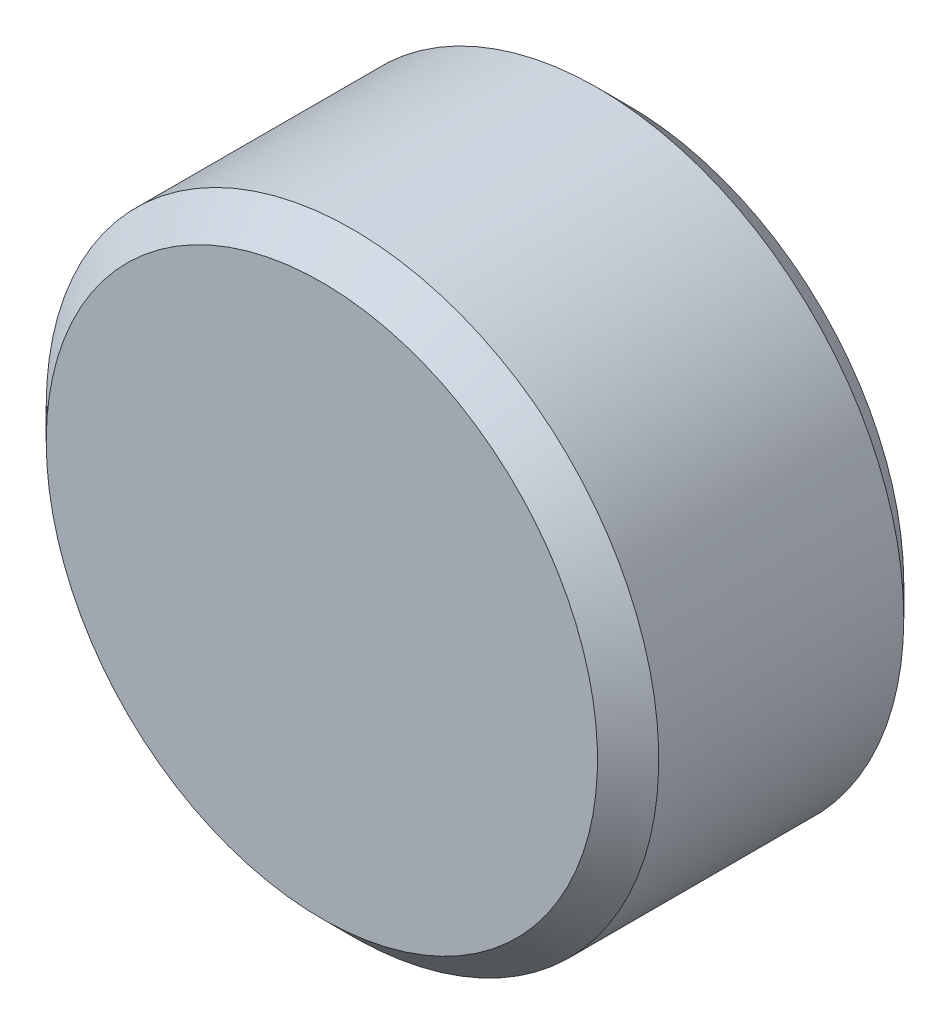
ISO-10303-21;
HEADER;
FILE_DESCRIPTION(('STEP AP214'),'2;1');
FILE_NAME('part.step','',(''),(''),'','','');
FILE_SCHEMA(('AUTOMOTIVE_DESIGN { 1 0 10303 214 1 1 1 1 }'));
ENDSEC;
DATA;
#1=APPLICATION_CONTEXT('core data for automotive mechanical design processes');
#2=APPLICATION_PROTOCOL_DEFINITION('international standard','automotive_design',2000,#1);
#3=PRODUCT_CONTEXT('',#1,'mechanical');
#4=PRODUCT('Part','Part','',(#3));
#5=PRODUCT_RELATED_PRODUCT_CATEGORY('part','',(#4));
#6=PRODUCT_DEFINITION_FORMATION('','',#4);
#7=PRODUCT_DEFINITION_CONTEXT('part definition',#1,'design');
#8=PRODUCT_DEFINITION('design','',#6,#7);
#9=PRODUCT_DEFINITION_SHAPE('','',#8);
#10=(LENGTH_UNIT() NAMED_UNIT(*) SI_UNIT(.MILLI.,.METRE.));
#11=(NAMED_UNIT(*) PLANE_ANGLE_UNIT() SI_UNIT($,.RADIAN.));
#12=(NAMED_UNIT(*) SI_UNIT($,.STERADIAN.) SOLID_ANGLE_UNIT());
#13=UNCERTAINTY_MEASURE_WITH_UNIT(LENGTH_MEASURE(1.E-05),#10,'distance_accuracy_value','');
#14=(GEOMETRIC_REPRESENTATION_CONTEXT(3) GLOBAL_UNCERTAINTY_ASSIGNED_CONTEXT((#13)) GLOBAL_UNIT_ASSIGNED_CONTEXT((#10,
#11,#12)) REPRESENTATION_CONTEXT('',''));
#15=CARTESIAN_POINT('',(0.,0.,0.));
#16=DIRECTION('',(0.,0.,1.));
#17=DIRECTION('',(1.,0.,0.));
#18=AXIS2_PLACEMENT_3D('',#15,#16,#17);
#19=CARTESIAN_POINT('',(0.,0.,3.));
#20=DIRECTION('',(0.,0.,-1.));
#21=DIRECTION('',(-1.,0.,0.));
#22=AXIS2_PLACEMENT_3D('',#19,#20,#21);
#23=CYLINDRICAL_SURFACE('',#22,3.);
#24=CARTESIAN_POINT('',(0.,0.,2.7));
#25=DIRECTION('',(0.,0.,1.));
#26=DIRECTION('',(1.,0.,0.));
#27=AXIS2_PLACEMENT_3D('',#24,#25,#26);
#28=CIRCLE('',#27,3.);
#29=CARTESIAN_POINT('',(-3.,0.,2.7));
#30=VERTEX_POINT('',#29);
#31=EDGE_CURVE('E38',#30,#30,#28,.F.);
#32=CARTESIAN_POINT('',(0.,0.,0.299999999999999));
#33=DIRECTION('',(0.,0.,1.));
#34=DIRECTION('',(1.,0.,0.));
#35=AXIS2_PLACEMENT_3D('',#32,#33,#34);
#36=CIRCLE('',#35,3.);
#37=CARTESIAN_POINT('',(-3.,0.,0.299999999999998));
#38=VERTEX_POINT('',#37);
#39=EDGE_CURVE('E42',#38,#38,#36,.T.);
#40=CARTESIAN_POINT('',(-3.,0.,2.7));
#41=CARTESIAN_POINT('',(-3.,0.,2.675));
#42=CARTESIAN_POINT('',(-3.,0.,2.65));
#43=CARTESIAN_POINT('',(-3.,0.,2.6));
#44=CARTESIAN_POINT('',(-3.,0.,2.575));
#45=CARTESIAN_POINT('',(-3.,0.,2.525));
#46=CARTESIAN_POINT('',(-3.,0.,2.5));
#47=CARTESIAN_POINT('',(-3.,0.,2.45));
#48=CARTESIAN_POINT('',(-3.,0.,2.425));
#49=CARTESIAN_POINT('',(-3.,0.,2.375));
#50=CARTESIAN_POINT('',(-3.,0.,2.35));
#51=CARTESIAN_POINT('',(-3.,0.,2.3));
#52=CARTESIAN_POINT('',(-3.,0.,2.275));
#53=CARTESIAN_POINT('',(-3.,0.,2.225));
#54=CARTESIAN_POINT('',(-3.,0.,2.2));
#55=CARTESIAN_POINT('',(-3.,0.,2.15));
#56=CARTESIAN_POINT('',(-3.,0.,2.125));
#57=CARTESIAN_POINT('',(-3.,0.,2.075));
#58=CARTESIAN_POINT('',(-3.,0.,2.05));
#59=CARTESIAN_POINT('',(-3.,0.,2.));
#60=CARTESIAN_POINT('',(-3.,0.,1.975));
#61=CARTESIAN_POINT('',(-3.,0.,1.925));
#62=CARTESIAN_POINT('',(-3.,0.,1.9));
#63=CARTESIAN_POINT('',(-3.,0.,1.85));
#64=CARTESIAN_POINT('',(-3.,0.,1.825));
#65=CARTESIAN_POINT('',(-3.,0.,1.775));
#66=CARTESIAN_POINT('',(-3.,0.,1.75));
#67=CARTESIAN_POINT('',(-3.,0.,1.7));
#68=CARTESIAN_POINT('',(-3.,0.,1.675));
#69=CARTESIAN_POINT('',(-3.,0.,1.625));
#70=CARTESIAN_POINT('',(-3.,0.,1.6));
#71=CARTESIAN_POINT('',(-3.,0.,1.55));
#72=CARTESIAN_POINT('',(-3.,0.,1.525));
#73=CARTESIAN_POINT('',(-3.,0.,1.475));
#74=CARTESIAN_POINT('',(-3.,0.,1.45));
#75=CARTESIAN_POINT('',(-3.,0.,1.4));
#76=CARTESIAN_POINT('',(-3.,0.,1.375));
#77=CARTESIAN_POINT('',(-3.,0.,1.325));
#78=CARTESIAN_POINT('',(-3.,0.,1.3));
#79=CARTESIAN_POINT('',(-3.,0.,1.25));
#80=CARTESIAN_POINT('',(-3.,0.,1.225));
#81=CARTESIAN_POINT('',(-3.,0.,1.175));
#82=CARTESIAN_POINT('',(-3.,0.,1.15));
#83=CARTESIAN_POINT('',(-3.,0.,1.1));
#84=CARTESIAN_POINT('',(-3.,0.,1.075));
#85=CARTESIAN_POINT('',(-3.,0.,1.025));
#86=CARTESIAN_POINT('',(-3.,0.,0.999999999999999));
#87=CARTESIAN_POINT('',(-3.,0.,0.949999999999999));
#88=CARTESIAN_POINT('',(-3.,0.,0.924999999999999));
#89=CARTESIAN_POINT('',(-3.,0.,0.874999999999999));
#90=CARTESIAN_POINT('',(-3.,0.,0.849999999999999));
#91=CARTESIAN_POINT('',(-3.,0.,0.799999999999999));
#92=CARTESIAN_POINT('',(-3.,0.,0.774999999999999));
#93=CARTESIAN_POINT('',(-3.,0.,0.724999999999999));
#94=CARTESIAN_POINT('',(-3.,0.,0.699999999999999));
#95=CARTESIAN_POINT('',(-3.,0.,0.649999999999999));
#96=CARTESIAN_POINT('',(-3.,0.,0.624999999999999));
#97=CARTESIAN_POINT('',(-3.,0.,0.574999999999999));
#98=CARTESIAN_POINT('',(-3.,0.,0.549999999999999));
#99=CARTESIAN_POINT('',(-3.,0.,0.499999999999998));
#100=CARTESIAN_POINT('',(-3.,0.,0.474999999999998));
#101=CARTESIAN_POINT('',(-3.,0.,0.424999999999998));
#102=CARTESIAN_POINT('',(-3.,0.,0.399999999999998));
#103=CARTESIAN_POINT('',(-3.,0.,0.349999999999998));
#104=CARTESIAN_POINT('',(-3.,0.,0.324999999999998));
#105=CARTESIAN_POINT('',(-3.,0.,0.299999999999998));
#106=B_SPLINE_CURVE_WITH_KNOTS('',3,(#40,#41,#42,#43,#44,#45,#46,#47,#48,#49,#50,#51,#52,#53,
#54,#55,#56,#57,#58,#59,#60,#61,#62,#63,#64,#65,#66,#67,#68,#69,#70,#71,#72,#73,#74,#75,#76,#77,
#78,#79,#80,#81,#82,#83,#84,#85,#86,#87,#88,#89,#90,#91,#92,#93,#94,#95,#96,#97,#98,#99,#100,
#101,#102,#103,#104,#105),.UNSPECIFIED.,.F.,.F.,(4,2,2,2,2,2,2,2,2,2,2,2,2,2,2,2,2,2,2,2,2,2,2,
2,2,2,2,2,2,2,2,2,4),(0.,0.075,0.15,0.225,0.3,0.375,0.45,0.525,0.600000000000001,
0.675000000000001,0.750000000000001,0.825000000000001,0.900000000000001,0.975000000000001,1.05,
1.125,1.2,1.275,1.35,1.425,1.5,1.575,1.65,1.725,1.8,1.875,1.95,2.025,2.1,2.175,2.25,2.325,2.4),.UNSPECIFIED.);
#107=EDGE_CURVE('BSEAM31',#30,#38,#106,.T.);
#108=ORIENTED_EDGE('',*,*,#31,.T.);
#109=ORIENTED_EDGE('',*,*,#39,.T.);
#110=ORIENTED_EDGE('',*,*,#107,.T.);
#111=ORIENTED_EDGE('',*,*,#107,.F.);
#112=EDGE_LOOP('',(#108,#110,#109,#111));
#113=FACE_BOUND('',#112,.T.);
#114=ADVANCED_FACE('F31',(#113),#23,.T.);
#115=CARTESIAN_POINT('',(0.,0.,3.));
#116=DIRECTION('',(0.,0.,1.));
#117=DIRECTION('',(1.,0.,0.));
#118=AXIS2_PLACEMENT_3D('',#115,#116,#117);
#119=PLANE('',#118);
#120=CARTESIAN_POINT('',(0.,0.,3.));
#121=DIRECTION('',(0.,0.,1.));
#122=DIRECTION('',(1.,0.,0.));
#123=AXIS2_PLACEMENT_3D('',#120,#121,#122);
#124=CIRCLE('',#123,2.7);
#125=CARTESIAN_POINT('',(-2.7,0.,3.));
#126=VERTEX_POINT('',#125);
#127=EDGE_CURVE('E46',#126,#126,#124,.T.);
#128=ORIENTED_EDGE('',*,*,#127,.T.);
#129=EDGE_LOOP('',(#128));
#130=FACE_BOUND('',#129,.T.);
#131=ADVANCED_FACE('F52',(#130),#119,.T.);
#132=CARTESIAN_POINT('',(0.,0.,0.));
#133=DIRECTION('',(0.,0.,1.));
#134=DIRECTION('',(1.,0.,0.));
#135=AXIS2_PLACEMENT_3D('',#132,#133,#134);
#136=PLANE('',#135);
#137=CARTESIAN_POINT('',(0.,0.,0.));
#138=DIRECTION('',(0.,0.,1.));
#139=DIRECTION('',(1.,0.,0.));
#140=AXIS2_PLACEMENT_3D('',#137,#138,#139);
#141=CIRCLE('',#140,2.7);
#142=CARTESIAN_POINT('',(2.7,0.,0.));
#143=VERTEX_POINT('',#142);
#144=EDGE_CURVE('E10',#143,#143,#141,.F.);
#145=ORIENTED_EDGE('',*,*,#144,.T.);
#146=EDGE_LOOP('',(#145));
#147=FACE_BOUND('',#146,.T.);
#148=ADVANCED_FACE('F56',(#147),#136,.F.);
#149=CARTESIAN_POINT('',(0.,0.,3.));
#150=DIRECTION('',(0.,0.,-1.));
#151=DIRECTION('',(-1.,0.,0.));
#152=AXIS2_PLACEMENT_3D('',#149,#150,#151);
#153=CONICAL_SURFACE('',#152,2.7,0.785398163397448);
#154=CARTESIAN_POINT('',(-3.,0.,2.7));
#155=CARTESIAN_POINT('',(-2.996875,0.,2.703125));
#156=CARTESIAN_POINT('',(-2.99375,0.,2.70625));
#157=CARTESIAN_POINT('',(-2.9875,0.,2.7125));
#158=CARTESIAN_POINT('',(-2.984375,0.,2.715625));
#159=CARTESIAN_POINT('',(-2.978125,0.,2.721875));
#160=CARTESIAN_POINT('',(-2.975,0.,2.725));
#161=CARTESIAN_POINT('',(-2.96875,0.,2.73125));
#162=CARTESIAN_POINT('',(-2.965625,0.,2.734375));
#163=CARTESIAN_POINT('',(-2.959375,0.,2.740625));
#164=CARTESIAN_POINT('',(-2.95625,0.,2.74375));
#165=CARTESIAN_POINT('',(-2.95,0.,2.75));
#166=CARTESIAN_POINT('',(-2.946875,0.,2.753125));
#167=CARTESIAN_POINT('',(-2.940625,0.,2.759375));
#168=CARTESIAN_POINT('',(-2.9375,0.,2.7625));
#169=CARTESIAN_POINT('',(-2.93125,0.,2.76875));
#170=CARTESIAN_POINT('',(-2.928125,0.,2.771875));
#171=CARTESIAN_POINT('',(-2.921875,0.,2.778125));
#172=CARTESIAN_POINT('',(-2.91875,0.,2.78125));
#173=CARTESIAN_POINT('',(-2.9125,0.,2.7875));
#174=CARTESIAN_POINT('',(-2.909375,0.,2.790625));
#175=CARTESIAN_POINT('',(-2.903125,0.,2.796875));
#176=CARTESIAN_POINT('',(-2.9,0.,2.8));
#177=CARTESIAN_POINT('',(-2.89375,0.,2.80625));
#178=CARTESIAN_POINT('',(-2.890625,0.,2.809375));
#179=CARTESIAN_POINT('',(-2.884375,0.,2.815625));
#180=CARTESIAN_POINT('',(-2.88125,0.,2.81875));
#181=CARTESIAN_POINT('',(-2.875,0.,2.825));
#182=CARTESIAN_POINT('',(-2.871875,0.,2.828125));
#183=CARTESIAN_POINT('',(-2.865625,0.,2.834375));
#184=CARTESIAN_POINT('',(-2.8625,0.,2.8375));
#185=CARTESIAN_POINT('',(-2.85625,0.,2.84375));
#186=CARTESIAN_POINT('',(-2.853125,0.,2.846875));
#187=CARTESIAN_POINT('',(-2.846875,0.,2.853125));
#188=CARTESIAN_POINT('',(-2.84375,0.,2.85625));
#189=CARTESIAN_POINT('',(-2.8375,0.,2.8625));
#190=CARTESIAN_POINT('',(-2.834375,0.,2.865625));
#191=CARTESIAN_POINT('',(-2.828125,0.,2.871875));
#192=CARTESIAN_POINT('',(-2.825,0.,2.875));
#193=CARTESIAN_POINT('',(-2.81875,0.,2.88125));
#194=CARTESIAN_POINT('',(-2.815625,0.,2.884375));
#195=CARTESIAN_POINT('',(-2.809375,0.,2.890625));
#196=CARTESIAN_POINT('',(-2.80625,0.,2.89375));
#197=CARTESIAN_POINT('',(-2.8,0.,2.9));
#198=CARTESIAN_POINT('',(-2.796875,0.,2.903125));
#199=CARTESIAN_POINT('',(-2.790625,0.,2.909375));
#200=CARTESIAN_POINT('',(-2.7875,0.,2.9125));
#201=CARTESIAN_POINT('',(-2.78125,0.,2.91875));
#202=CARTESIAN_POINT('',(-2.778125,0.,2.921875));
#203=CARTESIAN_POINT('',(-2.771875,0.,2.928125));
#204=CARTESIAN_POINT('',(-2.76875,0.,2.93125));
#205=CARTESIAN_POINT('',(-2.7625,0.,2.9375));
#206=CARTESIAN_POINT('',(-2.759375,0.,2.940625));
#207=CARTESIAN_POINT('',(-2.753125,0.,2.946875));
#208=CARTESIAN_POINT('',(-2.75,0.,2.95));
#209=CARTESIAN_POINT('',(-2.74375,0.,2.95625));
#210=CARTESIAN_POINT('',(-2.740625,0.,2.959375));
#211=CARTESIAN_POINT('',(-2.734375,0.,2.965625));
#212=CARTESIAN_POINT('',(-2.73125,0.,2.96875));
#213=CARTESIAN_POINT('',(-2.725,0.,2.975));
#214=CARTESIAN_POINT('',(-2.721875,0.,2.978125));
#215=CARTESIAN_POINT('',(-2.715625,0.,2.984375));
#216=CARTESIAN_POINT('',(-2.7125,0.,2.9875));
#217=CARTESIAN_POINT('',(-2.70625,0.,2.99375));
#218=CARTESIAN_POINT('',(-2.703125,0.,2.996875));
#219=CARTESIAN_POINT('',(-2.7,0.,3.));
#220=B_SPLINE_CURVE_WITH_KNOTS('',3,(#154,#155,#156,#157,#158,#159,#160,#161,#162,#163,#164,
#165,#166,#167,#168,#169,#170,#171,#172,#173,#174,#175,#176,#177,#178,#179,#180,#181,#182,#183,
#184,#185,#186,#187,#188,#189,#190,#191,#192,#193,#194,#195,#196,#197,#198,#199,#200,#201,#202,
#203,#204,#205,#206,#207,#208,#209,#210,#211,#212,#213,#214,#215,#216,#217,#218,#219),
.UNSPECIFIED.,.F.,.F.,(4,2,2,2,2,2,2,2,2,2,2,2,2,2,2,2,2,2,2,2,2,2,2,2,2,2,2,2,2,2,2,2,4),(0.,
0.0132582521472478,0.0265165042944954,0.0397747564417432,0.053033008588991,0.0662912607362386,
0.0795495128834861,0.0928077650307339,0.106066017177982,0.119324269325229,0.132582521472477,
0.145840773619725,0.159099025766973,0.17235727791422,0.185615530061468,0.198873782208716,
0.212132034355963,0.225390286503211,0.238648538650459,0.251906790797707,0.265165042944954,
0.278423295092202,0.29168154723945,0.304939799386697,0.318198051533945,0.331456303681193,
0.34471455582844,0.357972807975688,0.371231060122935,0.384489312270184,0.397747564417431,
0.411005816564679,0.424264068711927),.UNSPECIFIED.);
#221=EDGE_CURVE('BSEAM54',#30,#126,#220,.T.);
#222=ORIENTED_EDGE('',*,*,#31,.F.);
#223=ORIENTED_EDGE('',*,*,#127,.F.);
#224=ORIENTED_EDGE('',*,*,#221,.T.);
#225=ORIENTED_EDGE('',*,*,#221,.F.);
#226=EDGE_LOOP('',(#222,#224,#223,#225));
#227=FACE_BOUND('',#226,.T.);
#228=ADVANCED_FACE('F54',(#227),#153,.T.);
#229=CARTESIAN_POINT('',(0.,0.,0.299999999999999));
#230=DIRECTION('',(0.,0.,1.));
#231=DIRECTION('',(1.,0.,0.));
#232=AXIS2_PLACEMENT_3D('',#229,#230,#231);
#233=CONICAL_SURFACE('',#232,3.,0.78539816339745);
#234=ORIENTED_EDGE('',*,*,#144,.F.);
#235=EDGE_LOOP('',(#234));
#236=FACE_BOUND('',#235,.T.);
#237=ORIENTED_EDGE('',*,*,#39,.F.);
#238=EDGE_LOOP('',(#237));
#239=FACE_BOUND('',#238,.T.);
#240=ADVANCED_FACE('F33',(#236,#239),#233,.T.);
#241=CLOSED_SHELL('',(#114,#131,#148,#228,#240));
#242=MANIFOLD_SOLID_BREP('B2',#241);
#243=ADVANCED_BREP_SHAPE_REPRESENTATION('',(#18,#242),#14);
#244=SHAPE_DEFINITION_REPRESENTATION(#9,#243);
ENDSEC;
END-ISO-10303-21;
